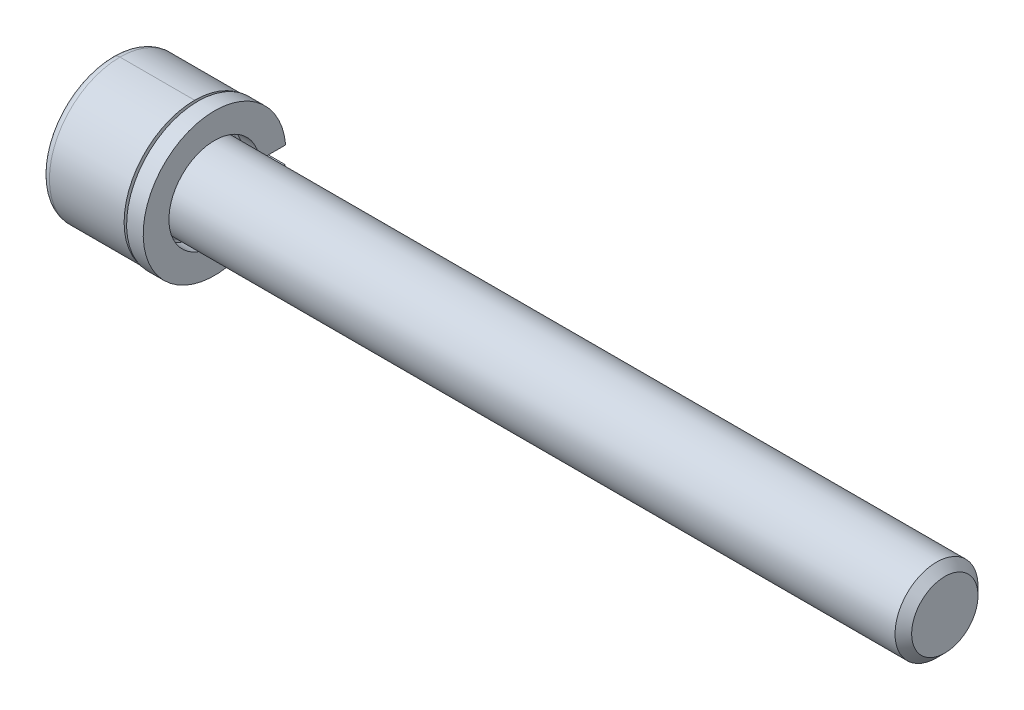
ISO-10303-21;
HEADER;
FILE_DESCRIPTION(('STEP AP214'),'2;1');
FILE_NAME('part.step','',(''),(''),'','','');
FILE_SCHEMA(('AUTOMOTIVE_DESIGN { 1 0 10303 214 1 1 1 1 }'));
ENDSEC;
DATA;
#1=APPLICATION_CONTEXT('core data for automotive mechanical design processes');
#2=APPLICATION_PROTOCOL_DEFINITION('international standard','automotive_design',2000,#1);
#3=PRODUCT_CONTEXT('',#1,'mechanical');
#4=PRODUCT('Part','Part','',(#3));
#5=PRODUCT_RELATED_PRODUCT_CATEGORY('part','',(#4));
#6=PRODUCT_DEFINITION_FORMATION('','',#4);
#7=PRODUCT_DEFINITION_CONTEXT('part definition',#1,'design');
#8=PRODUCT_DEFINITION('design','',#6,#7);
#9=PRODUCT_DEFINITION_SHAPE('','',#8);
#10=(LENGTH_UNIT() NAMED_UNIT(*) SI_UNIT(.MILLI.,.METRE.));
#11=(NAMED_UNIT(*) PLANE_ANGLE_UNIT() SI_UNIT($,.RADIAN.));
#12=(NAMED_UNIT(*) SI_UNIT($,.STERADIAN.) SOLID_ANGLE_UNIT());
#13=UNCERTAINTY_MEASURE_WITH_UNIT(LENGTH_MEASURE(1.E-05),#10,'distance_accuracy_value','');
#14=(GEOMETRIC_REPRESENTATION_CONTEXT(3) GLOBAL_UNCERTAINTY_ASSIGNED_CONTEXT((#13)) GLOBAL_UNIT_ASSIGNED_CONTEXT((#10,
#11,#12)) REPRESENTATION_CONTEXT('',''));
#15=CARTESIAN_POINT('',(0.,0.,0.));
#16=DIRECTION('',(0.,0.,1.));
#17=DIRECTION('',(1.,0.,0.));
#18=AXIS2_PLACEMENT_3D('',#15,#16,#17);
#19=CARTESIAN_POINT('',(1.2,0.,0.));
#20=DIRECTION('',(-1.,0.,0.));
#21=DIRECTION('',(0.,-1.,0.));
#22=AXIS2_PLACEMENT_3D('',#19,#20,#21);
#23=CYLINDRICAL_SURFACE('',#22,4.3);
#24=CARTESIAN_POINT('',(0.2,0.,0.));
#25=DIRECTION('',(1.,0.,0.));
#26=DIRECTION('',(0.,1.,0.));
#27=AXIS2_PLACEMENT_3D('',#24,#25,#26);
#28=CIRCLE('',#27,4.3);
#29=CARTESIAN_POINT('',(0.2,0.374431043820241,-4.28366681634131));
#30=VERTEX_POINT('',#29);
#31=CARTESIAN_POINT('',(0.2,-0.63593269228035,-4.25271555725152));
#32=VERTEX_POINT('',#31);
#33=EDGE_CURVE('P0_E79',#30,#32,#28,.T.);
#34=ORIENTED_EDGE('',*,*,#33,.T.);
#35=DIRECTION('',(-1.,0.,0.));
#36=VECTOR('',#35,1.);
#37=CARTESIAN_POINT('',(1.2,-0.63593269228035,-4.25271555725152));
#38=LINE('',#37,#36);
#39=CARTESIAN_POINT('',(1.2,-0.63593269228035,-4.25271555725152));
#40=VERTEX_POINT('',#39);
#41=EDGE_CURVE('P0_E11',#40,#32,#38,.T.);
#42=ORIENTED_EDGE('',*,*,#41,.F.);
#43=CARTESIAN_POINT('',(1.2,0.,0.));
#44=DIRECTION('',(1.,0.,0.));
#45=DIRECTION('',(0.,1.,0.));
#46=AXIS2_PLACEMENT_3D('',#43,#44,#45);
#47=CIRCLE('',#46,4.3);
#48=CARTESIAN_POINT('',(1.2,0.374431043820241,-4.28366681634131));
#49=VERTEX_POINT('',#48);
#50=EDGE_CURVE('P0_E69',#49,#40,#47,.T.);
#51=ORIENTED_EDGE('',*,*,#50,.F.);
#52=DIRECTION('',(-1.,0.,0.));
#53=VECTOR('',#52,1.);
#54=CARTESIAN_POINT('',(1.2,0.374431043820241,-4.28366681634131));
#55=LINE('',#54,#53);
#56=EDGE_CURVE('P0_E76',#49,#30,#55,.T.);
#57=ORIENTED_EDGE('',*,*,#56,.T.);
#58=EDGE_LOOP('',(#34,#42,#51,#57));
#59=FACE_BOUND('',#58,.T.);
#60=ADVANCED_FACE('P0_F17',(#59),#23,.T.);
#61=CARTESIAN_POINT('',(1.2,-0.63593269228035,-2.67546063527181));
#62=DIRECTION('',(0.,-1.,0.));
#63=DIRECTION('',(1.,0.,0.));
#64=AXIS2_PLACEMENT_3D('',#61,#62,#63);
#65=PLANE('',#64);
#66=DIRECTION('',(0.,0.,1.));
#67=VECTOR('',#66,1.);
#68=CARTESIAN_POINT('',(0.2,-0.63593269228035,-2.67546063527181));
#69=LINE('',#68,#67);
#70=CARTESIAN_POINT('',(0.2,-0.63593269228035,-2.67546063527181));
#71=VERTEX_POINT('',#70);
#72=EDGE_CURVE('P0_E71',#32,#71,#69,.T.);
#73=ORIENTED_EDGE('',*,*,#72,.T.);
#74=DIRECTION('',(-1.,0.,0.));
#75=VECTOR('',#74,1.);
#76=CARTESIAN_POINT('',(1.2,-0.63593269228035,-2.67546063527181));
#77=LINE('',#76,#75);
#78=CARTESIAN_POINT('',(1.2,-0.63593269228035,-2.67546063527181));
#79=VERTEX_POINT('',#78);
#80=EDGE_CURVE('P0_E25',#79,#71,#77,.T.);
#81=ORIENTED_EDGE('',*,*,#80,.F.);
#82=DIRECTION('',(0.,0.,1.));
#83=VECTOR('',#82,1.);
#84=CARTESIAN_POINT('',(1.2,-0.63593269228035,-2.67546063527181));
#85=LINE('',#84,#83);
#86=EDGE_CURVE('P0_E64',#40,#79,#85,.T.);
#87=ORIENTED_EDGE('',*,*,#86,.F.);
#88=ORIENTED_EDGE('',*,*,#41,.T.);
#89=EDGE_LOOP('',(#73,#81,#87,#88));
#90=FACE_BOUND('',#89,.T.);
#91=ADVANCED_FACE('P0_F75',(#90),#65,.F.);
#92=CARTESIAN_POINT('',(1.2,0.,0.));
#93=DIRECTION('',(-1.,0.,0.));
#94=DIRECTION('',(0.,-1.,0.));
#95=AXIS2_PLACEMENT_3D('',#92,#93,#94);
#96=CYLINDRICAL_SURFACE('',#95,2.75);
#97=CARTESIAN_POINT('',(0.2,0.,0.));
#98=DIRECTION('',(-1.,0.,0.));
#99=DIRECTION('',(0.,1.,0.));
#100=AXIS2_PLACEMENT_3D('',#97,#98,#99);
#101=CIRCLE('',#100,2.75);
#102=CARTESIAN_POINT('',(0.2,0.37443104382024,-2.72439009567714));
#103=VERTEX_POINT('',#102);
#104=EDGE_CURVE('P0_E49',#71,#103,#101,.T.);
#105=ORIENTED_EDGE('',*,*,#104,.T.);
#106=DIRECTION('',(-1.,0.,0.));
#107=VECTOR('',#106,1.);
#108=CARTESIAN_POINT('',(1.2,0.374431043820241,-2.72439009567714));
#109=LINE('',#108,#107);
#110=CARTESIAN_POINT('',(1.2,0.374431043820241,-2.72439009567714));
#111=VERTEX_POINT('',#110);
#112=EDGE_CURVE('P0_E73',#111,#103,#109,.T.);
#113=ORIENTED_EDGE('',*,*,#112,.F.);
#114=CARTESIAN_POINT('',(1.2,0.,0.));
#115=DIRECTION('',(-1.,0.,0.));
#116=DIRECTION('',(0.,1.,0.));
#117=AXIS2_PLACEMENT_3D('',#114,#115,#116);
#118=CIRCLE('',#117,2.75);
#119=EDGE_CURVE('P0_E67',#79,#111,#118,.T.);
#120=ORIENTED_EDGE('',*,*,#119,.F.);
#121=ORIENTED_EDGE('',*,*,#80,.T.);
#122=EDGE_LOOP('',(#105,#113,#120,#121));
#123=FACE_BOUND('',#122,.T.);
#124=ADVANCED_FACE('P0_F72',(#123),#96,.F.);
#125=CARTESIAN_POINT('',(1.2,0.374431043820241,-2.72439009567714));
#126=DIRECTION('',(0.,1.,0.));
#127=DIRECTION('',(-1.,0.,0.));
#128=AXIS2_PLACEMENT_3D('',#125,#126,#127);
#129=PLANE('',#128);
#130=DIRECTION('',(0.,0.,-1.));
#131=VECTOR('',#130,1.);
#132=CARTESIAN_POINT('',(0.2,0.374431043820241,-2.72439009567714));
#133=LINE('',#132,#131);
#134=EDGE_CURVE('P0_E57',#103,#30,#133,.T.);
#135=ORIENTED_EDGE('',*,*,#134,.T.);
#136=ORIENTED_EDGE('',*,*,#56,.F.);
#137=DIRECTION('',(0.,0.,-1.));
#138=VECTOR('',#137,1.);
#139=CARTESIAN_POINT('',(1.2,0.374431043820241,-2.72439009567714));
#140=LINE('',#139,#138);
#141=EDGE_CURVE('P0_E31',#111,#49,#140,.T.);
#142=ORIENTED_EDGE('',*,*,#141,.F.);
#143=ORIENTED_EDGE('',*,*,#112,.T.);
#144=EDGE_LOOP('',(#135,#136,#142,#143));
#145=FACE_BOUND('',#144,.T.);
#146=ADVANCED_FACE('P0_F87',(#145),#129,.F.);
#147=CARTESIAN_POINT('',(1.2,0.,0.));
#148=DIRECTION('',(1.,0.,0.));
#149=DIRECTION('',(0.,1.,0.));
#150=AXIS2_PLACEMENT_3D('',#147,#148,#149);
#151=PLANE('',#150);
#152=ORIENTED_EDGE('',*,*,#50,.T.);
#153=ORIENTED_EDGE('',*,*,#86,.T.);
#154=ORIENTED_EDGE('',*,*,#119,.T.);
#155=ORIENTED_EDGE('',*,*,#141,.T.);
#156=EDGE_LOOP('',(#152,#153,#154,#155));
#157=FACE_BOUND('',#156,.T.);
#158=ADVANCED_FACE('P0_F63',(#157),#151,.T.);
#159=CARTESIAN_POINT('',(0.2,0.,0.));
#160=DIRECTION('',(1.,0.,0.));
#161=DIRECTION('',(0.,1.,0.));
#162=AXIS2_PLACEMENT_3D('',#159,#160,#161);
#163=PLANE('',#162);
#164=ORIENTED_EDGE('',*,*,#33,.F.);
#165=ORIENTED_EDGE('',*,*,#134,.F.);
#166=ORIENTED_EDGE('',*,*,#104,.F.);
#167=ORIENTED_EDGE('',*,*,#72,.F.);
#168=EDGE_LOOP('',(#164,#165,#166,#167));
#169=FACE_BOUND('',#168,.T.);
#170=ADVANCED_FACE('P0_F89',(#169),#163,.F.);
#171=CLOSED_SHELL('',(#60,#91,#124,#146,#158,#170));
#172=MANIFOLD_SOLID_BREP('P0_B1',#171);
#173=CARTESIAN_POINT('',(-1.17700185815197,0.,0.));
#174=DIRECTION('',(-1.,0.,0.));
#175=DIRECTION('',(0.,1.,0.));
#176=AXIS2_PLACEMENT_3D('',#173,#174,#175);
#177=CYLINDRICAL_SURFACE('',#176,2.5);
#178=CARTESIAN_POINT('',(44.7,0.,0.));
#179=DIRECTION('',(-1.,0.,0.));
#180=DIRECTION('',(0.,-1.,0.));
#181=AXIS2_PLACEMENT_3D('',#178,#179,#180);
#182=CIRCLE('',#181,2.5);
#183=CARTESIAN_POINT('',(44.7,-2.5,0.));
#184=VERTEX_POINT('',#183);
#185=EDGE_CURVE('P1_E21',#184,#184,#182,.T.);
#186=ORIENTED_EDGE('',*,*,#185,.T.);
#187=EDGE_LOOP('',(#186));
#188=FACE_BOUND('',#187,.T.);
#189=CARTESIAN_POINT('',(0.200000000000003,0.,0.));
#190=DIRECTION('',(-1.,0.,0.));
#191=DIRECTION('',(0.,-1.,0.));
#192=AXIS2_PLACEMENT_3D('',#189,#190,#191);
#193=CIRCLE('',#192,2.5);
#194=CARTESIAN_POINT('',(0.200000000000003,2.5,0.));
#195=VERTEX_POINT('',#194);
#196=CARTESIAN_POINT('',(0.200000000000003,-2.5,0.));
#197=VERTEX_POINT('',#196);
#198=EDGE_CURVE('P1_E31',#195,#197,#193,.T.);
#199=ORIENTED_EDGE('',*,*,#198,.F.);
#200=CARTESIAN_POINT('',(0.200000000000003,0.,0.));
#201=DIRECTION('',(-1.,0.,0.));
#202=DIRECTION('',(0.,-1.,0.));
#203=AXIS2_PLACEMENT_3D('',#200,#201,#202);
#204=CIRCLE('',#203,2.5);
#205=EDGE_CURVE('P1_E252',#197,#195,#204,.T.);
#206=ORIENTED_EDGE('',*,*,#205,.F.);
#207=EDGE_LOOP('',(#199,#206));
#208=FACE_BOUND('',#207,.T.);
#209=ADVANCED_FACE('P1_F17',(#188,#208),#177,.T.);
#210=CARTESIAN_POINT('',(0.200000000000003,0.,0.));
#211=DIRECTION('',(-1.,0.,0.));
#212=DIRECTION('',(0.,1.,0.));
#213=AXIS2_PLACEMENT_3D('',#210,#211,#212);
#214=TOROIDAL_SURFACE('',#213,2.7,0.2);
#215=CARTESIAN_POINT('',(0.2,2.7,0.));
#216=DIRECTION('',(0.,0.,1.));
#217=DIRECTION('',(0.,-1.,0.));
#218=AXIS2_PLACEMENT_3D('',#215,#216,#217);
#219=CIRCLE('',#218,0.2);
#220=CARTESIAN_POINT('',(0.,2.7,0.));
#221=VERTEX_POINT('',#220);
#222=EDGE_CURVE('P1_E254',#221,#195,#219,.T.);
#223=ORIENTED_EDGE('',*,*,#222,.F.);
#224=CARTESIAN_POINT('',(0.,0.,0.));
#225=DIRECTION('',(-1.,0.,0.));
#226=DIRECTION('',(0.,-1.,0.));
#227=AXIS2_PLACEMENT_3D('',#224,#225,#226);
#228=CIRCLE('',#227,2.7);
#229=CARTESIAN_POINT('',(0.,-2.7,0.));
#230=VERTEX_POINT('',#229);
#231=EDGE_CURVE('P1_E250',#230,#221,#228,.T.);
#232=ORIENTED_EDGE('',*,*,#231,.F.);
#233=CARTESIAN_POINT('',(0.200000000000003,-2.7,0.));
#234=DIRECTION('',(0.,0.,-1.));
#235=DIRECTION('',(-1.,0.,0.));
#236=AXIS2_PLACEMENT_3D('',#233,#234,#235);
#237=CIRCLE('',#236,0.2);
#238=EDGE_CURVE('P1_E249',#230,#197,#237,.T.);
#239=ORIENTED_EDGE('',*,*,#238,.T.);
#240=ORIENTED_EDGE('',*,*,#205,.T.);
#241=EDGE_LOOP('',(#223,#232,#239,#240));
#242=FACE_BOUND('',#241,.T.);
#243=ADVANCED_FACE('P1_F264',(#242),#214,.F.);
#244=CARTESIAN_POINT('',(0.200000000000003,0.,0.));
#245=DIRECTION('',(-1.,0.,0.));
#246=DIRECTION('',(0.,1.,0.));
#247=AXIS2_PLACEMENT_3D('',#244,#245,#246);
#248=TOROIDAL_SURFACE('',#247,2.7,0.2);
#249=CARTESIAN_POINT('',(0.,0.,0.));
#250=DIRECTION('',(-1.,0.,0.));
#251=DIRECTION('',(0.,-1.,0.));
#252=AXIS2_PLACEMENT_3D('',#249,#250,#251);
#253=CIRCLE('',#252,2.7);
#254=EDGE_CURVE('P1_E242',#221,#230,#253,.T.);
#255=ORIENTED_EDGE('',*,*,#254,.F.);
#256=ORIENTED_EDGE('',*,*,#222,.T.);
#257=ORIENTED_EDGE('',*,*,#198,.T.);
#258=ORIENTED_EDGE('',*,*,#238,.F.);
#259=EDGE_LOOP('',(#255,#256,#257,#258));
#260=FACE_BOUND('',#259,.T.);
#261=ADVANCED_FACE('P1_F267',(#260),#248,.F.);
#262=CARTESIAN_POINT('',(0.,4.25,0.));
#263=DIRECTION('',(-1.,0.,0.));
#264=DIRECTION('',(0.,1.,0.));
#265=AXIS2_PLACEMENT_3D('',#262,#263,#264);
#266=PLANE('',#265);
#267=CARTESIAN_POINT('',(0.,0.,0.));
#268=DIRECTION('',(-1.,0.,0.));
#269=DIRECTION('',(0.,-1.,0.));
#270=AXIS2_PLACEMENT_3D('',#267,#268,#269);
#271=CIRCLE('',#270,4.25);
#272=CARTESIAN_POINT('',(0.,-4.25,0.));
#273=VERTEX_POINT('',#272);
#274=CARTESIAN_POINT('',(0.,4.25,0.));
#275=VERTEX_POINT('',#274);
#276=EDGE_CURVE('P1_E236',#273,#275,#271,.T.);
#277=ORIENTED_EDGE('',*,*,#276,.F.);
#278=CARTESIAN_POINT('',(0.,0.,0.));
#279=DIRECTION('',(-1.,0.,0.));
#280=DIRECTION('',(0.,-1.,0.));
#281=AXIS2_PLACEMENT_3D('',#278,#279,#280);
#282=CIRCLE('',#281,4.25);
#283=EDGE_CURVE('P1_E228',#275,#273,#282,.T.);
#284=ORIENTED_EDGE('',*,*,#283,.F.);
#285=EDGE_LOOP('',(#277,#284));
#286=FACE_BOUND('',#285,.T.);
#287=ORIENTED_EDGE('',*,*,#231,.T.);
#288=ORIENTED_EDGE('',*,*,#254,.T.);
#289=EDGE_LOOP('',(#287,#288));
#290=FACE_BOUND('',#289,.T.);
#291=ADVANCED_FACE('P1_F271',(#286,#290),#266,.F.);
#292=CARTESIAN_POINT('',(-1.17700185815197,0.,0.));
#293=DIRECTION('',(-1.,0.,0.));
#294=DIRECTION('',(0.,1.,0.));
#295=AXIS2_PLACEMENT_3D('',#292,#293,#294);
#296=CYLINDRICAL_SURFACE('',#295,4.25);
#297=ORIENTED_EDGE('',*,*,#276,.T.);
#298=DIRECTION('',(-1.,0.,0.));
#299=VECTOR('',#298,1.);
#300=CARTESIAN_POINT('',(-1.17700185815198,4.25,0.));
#301=LINE('',#300,#299);
#302=CARTESIAN_POINT('',(-4.5,4.25,0.));
#303=VERTEX_POINT('',#302);
#304=EDGE_CURVE('P1_E233',#303,#275,#301,.F.);
#305=ORIENTED_EDGE('',*,*,#304,.F.);
#306=CARTESIAN_POINT('',(-4.5,0.,0.));
#307=DIRECTION('',(-1.,0.,0.));
#308=DIRECTION('',(0.,-1.,0.));
#309=AXIS2_PLACEMENT_3D('',#306,#307,#308);
#310=CIRCLE('',#309,4.25);
#311=CARTESIAN_POINT('',(-4.5,-4.25,0.));
#312=VERTEX_POINT('',#311);
#313=EDGE_CURVE('P1_E225',#312,#303,#310,.T.);
#314=ORIENTED_EDGE('',*,*,#313,.F.);
#315=DIRECTION('',(-1.,0.,0.));
#316=VECTOR('',#315,1.);
#317=CARTESIAN_POINT('',(-1.17700185815197,-4.25,0.));
#318=LINE('',#317,#316);
#319=EDGE_CURVE('P1_E223',#312,#273,#318,.F.);
#320=ORIENTED_EDGE('',*,*,#319,.T.);
#321=EDGE_LOOP('',(#297,#305,#314,#320));
#322=FACE_BOUND('',#321,.T.);
#323=ADVANCED_FACE('P1_F272',(#322),#296,.T.);
#324=CARTESIAN_POINT('',(-1.17700185815197,0.,0.));
#325=DIRECTION('',(-1.,0.,0.));
#326=DIRECTION('',(0.,1.,0.));
#327=AXIS2_PLACEMENT_3D('',#324,#325,#326);
#328=CYLINDRICAL_SURFACE('',#327,4.25);
#329=ORIENTED_EDGE('',*,*,#304,.T.);
#330=ORIENTED_EDGE('',*,*,#283,.T.);
#331=ORIENTED_EDGE('',*,*,#319,.F.);
#332=CARTESIAN_POINT('',(-4.5,0.,0.));
#333=DIRECTION('',(-1.,0.,0.));
#334=DIRECTION('',(0.,-1.,0.));
#335=AXIS2_PLACEMENT_3D('',#332,#333,#334);
#336=CIRCLE('',#335,4.25);
#337=EDGE_CURVE('P1_E214',#303,#312,#336,.T.);
#338=ORIENTED_EDGE('',*,*,#337,.F.);
#339=EDGE_LOOP('',(#329,#330,#331,#338));
#340=FACE_BOUND('',#339,.T.);
#341=ADVANCED_FACE('P1_F282',(#340),#328,.T.);
#342=CARTESIAN_POINT('',(-4.5,0.,0.));
#343=DIRECTION('',(-1.,0.,0.));
#344=DIRECTION('',(0.,1.,0.));
#345=AXIS2_PLACEMENT_3D('',#342,#343,#344);
#346=TOROIDAL_SURFACE('',#345,3.75,0.5);
#347=ORIENTED_EDGE('',*,*,#313,.T.);
#348=CARTESIAN_POINT('',(-4.5,3.75,0.));
#349=DIRECTION('',(0.,0.,1.));
#350=DIRECTION('',(0.,-1.,0.));
#351=AXIS2_PLACEMENT_3D('',#348,#349,#350);
#352=CIRCLE('',#351,0.5);
#353=CARTESIAN_POINT('',(-5.,3.75,0.));
#354=VERTEX_POINT('',#353);
#355=EDGE_CURVE('P1_E217',#354,#303,#352,.F.);
#356=ORIENTED_EDGE('',*,*,#355,.F.);
#357=CARTESIAN_POINT('',(-5.,0.,0.));
#358=DIRECTION('',(-1.,0.,0.));
#359=DIRECTION('',(0.,-1.,0.));
#360=AXIS2_PLACEMENT_3D('',#357,#358,#359);
#361=CIRCLE('',#360,3.75);
#362=CARTESIAN_POINT('',(-5.,-3.75,0.));
#363=VERTEX_POINT('',#362);
#364=EDGE_CURVE('P1_E209',#363,#354,#361,.T.);
#365=ORIENTED_EDGE('',*,*,#364,.F.);
#366=CARTESIAN_POINT('',(-4.5,-3.75,0.));
#367=DIRECTION('',(0.,0.,-1.));
#368=DIRECTION('',(-1.,0.,0.));
#369=AXIS2_PLACEMENT_3D('',#366,#367,#368);
#370=CIRCLE('',#369,0.5);
#371=EDGE_CURVE('P1_E211',#363,#312,#370,.F.);
#372=ORIENTED_EDGE('',*,*,#371,.T.);
#373=EDGE_LOOP('',(#347,#356,#365,#372));
#374=FACE_BOUND('',#373,.T.);
#375=ADVANCED_FACE('P1_F368',(#374),#346,.T.);
#376=CARTESIAN_POINT('',(-4.5,0.,0.));
#377=DIRECTION('',(-1.,0.,0.));
#378=DIRECTION('',(0.,1.,0.));
#379=AXIS2_PLACEMENT_3D('',#376,#377,#378);
#380=TOROIDAL_SURFACE('',#379,3.75,0.5);
#381=ORIENTED_EDGE('',*,*,#355,.T.);
#382=ORIENTED_EDGE('',*,*,#337,.T.);
#383=ORIENTED_EDGE('',*,*,#371,.F.);
#384=CARTESIAN_POINT('',(-5.,0.,0.));
#385=DIRECTION('',(-1.,0.,0.));
#386=DIRECTION('',(0.,-1.,0.));
#387=AXIS2_PLACEMENT_3D('',#384,#385,#386);
#388=CIRCLE('',#387,3.75);
#389=EDGE_CURVE('P1_E200',#354,#363,#388,.T.);
#390=ORIENTED_EDGE('',*,*,#389,.F.);
#391=EDGE_LOOP('',(#381,#382,#383,#390));
#392=FACE_BOUND('',#391,.T.);
#393=ADVANCED_FACE('P1_F362',(#392),#380,.T.);
#394=CARTESIAN_POINT('',(-5.,2.2915,0.));
#395=DIRECTION('',(1.,0.,0.));
#396=DIRECTION('',(0.,-1.,0.));
#397=AXIS2_PLACEMENT_3D('',#394,#395,#396);
#398=PLANE('',#397);
#399=DIRECTION('',(0.,0.5,0.866025403784438));
#400=VECTOR('',#399,1.);
#401=CARTESIAN_POINT('',(-5.,-2.2915,0.));
#402=LINE('',#401,#400);
#403=CARTESIAN_POINT('',(-5.,-2.2915,0.));
#404=VERTEX_POINT('',#403);
#405=CARTESIAN_POINT('',(-5.,-1.14575,1.98449721277204));
#406=VERTEX_POINT('',#405);
#407=EDGE_CURVE('P1_E163',#404,#406,#402,.T.);
#408=ORIENTED_EDGE('',*,*,#407,.F.);
#409=DIRECTION('',(0.,-0.5,0.866025403784438));
#410=VECTOR('',#409,1.);
#411=CARTESIAN_POINT('',(-5.,-1.14575,-1.98449721277204));
#412=LINE('',#411,#410);
#413=CARTESIAN_POINT('',(-5.,-1.14575,-1.98449721277204));
#414=VERTEX_POINT('',#413);
#415=EDGE_CURVE('P1_E154',#414,#404,#412,.T.);
#416=ORIENTED_EDGE('',*,*,#415,.F.);
#417=DIRECTION('',(0.,-1.,0.));
#418=VECTOR('',#417,1.);
#419=CARTESIAN_POINT('',(-5.,1.14575,-1.98449721277205));
#420=LINE('',#419,#418);
#421=CARTESIAN_POINT('',(-5.,1.14575,-1.98449721277204));
#422=VERTEX_POINT('',#421);
#423=EDGE_CURVE('P1_E178',#422,#414,#420,.T.);
#424=ORIENTED_EDGE('',*,*,#423,.F.);
#425=DIRECTION('',(0.,-0.5,-0.866025403784439));
#426=VECTOR('',#425,1.);
#427=CARTESIAN_POINT('',(-5.,2.2915,0.));
#428=LINE('',#427,#426);
#429=CARTESIAN_POINT('',(-5.,2.2915,0.));
#430=VERTEX_POINT('',#429);
#431=EDGE_CURVE('P1_E183',#430,#422,#428,.T.);
#432=ORIENTED_EDGE('',*,*,#431,.F.);
#433=DIRECTION('',(0.,0.5,-0.866025403784439));
#434=VECTOR('',#433,1.);
#435=CARTESIAN_POINT('',(-5.,1.14575,1.98449721277204));
#436=LINE('',#435,#434);
#437=CARTESIAN_POINT('',(-5.,1.14575,1.98449721277204));
#438=VERTEX_POINT('',#437);
#439=EDGE_CURVE('P1_E156',#438,#430,#436,.T.);
#440=ORIENTED_EDGE('',*,*,#439,.F.);
#441=DIRECTION('',(0.,1.,0.));
#442=VECTOR('',#441,1.);
#443=CARTESIAN_POINT('',(-5.,-1.14575,1.98449721277204));
#444=LINE('',#443,#442);
#445=EDGE_CURVE('P1_E168',#406,#438,#444,.T.);
#446=ORIENTED_EDGE('',*,*,#445,.F.);
#447=EDGE_LOOP('',(#408,#416,#424,#432,#440,#446));
#448=FACE_BOUND('',#447,.T.);
#449=ORIENTED_EDGE('',*,*,#364,.T.);
#450=ORIENTED_EDGE('',*,*,#389,.T.);
#451=EDGE_LOOP('',(#449,#450));
#452=FACE_BOUND('',#451,.T.);
#453=ADVANCED_FACE('P1_F359',(#448,#452),#398,.F.);
#454=CARTESIAN_POINT('',(-2.5,2.2915,0.));
#455=DIRECTION('',(0.,0.866025403784439,-0.5));
#456=DIRECTION('',(0.,-0.5,-0.866025403784439));
#457=AXIS2_PLACEMENT_3D('',#454,#455,#456);
#458=PLANE('',#457);
#459=ORIENTED_EDGE('',*,*,#431,.T.);
#460=DIRECTION('',(-1.,0.,0.));
#461=VECTOR('',#460,1.);
#462=CARTESIAN_POINT('',(-2.5,1.14575,-1.98449721277205));
#463=LINE('',#462,#461);
#464=CARTESIAN_POINT('',(-2.5,1.14575,-1.98449721277205));
#465=VERTEX_POINT('',#464);
#466=EDGE_CURVE('P1_E190',#465,#422,#463,.T.);
#467=ORIENTED_EDGE('',*,*,#466,.F.);
#468=DIRECTION('',(0.,-0.5,-0.866025403784439));
#469=VECTOR('',#468,1.);
#470=CARTESIAN_POINT('',(-2.5,2.2915,0.));
#471=LINE('',#470,#469);
#472=CARTESIAN_POINT('',(-2.5,2.2915,0.));
#473=VERTEX_POINT('',#472);
#474=EDGE_CURVE('P1_E164',#473,#465,#471,.T.);
#475=ORIENTED_EDGE('',*,*,#474,.F.);
#476=DIRECTION('',(-1.,0.,0.));
#477=VECTOR('',#476,1.);
#478=CARTESIAN_POINT('',(-2.5,2.2915,0.));
#479=LINE('',#478,#477);
#480=EDGE_CURVE('P1_E177',#473,#430,#479,.T.);
#481=ORIENTED_EDGE('',*,*,#480,.T.);
#482=EDGE_LOOP('',(#459,#467,#475,#481));
#483=FACE_BOUND('',#482,.T.);
#484=ADVANCED_FACE('P1_F353',(#483),#458,.F.);
#485=CARTESIAN_POINT('',(-2.5,-1.14575,1.98449721277204));
#486=DIRECTION('',(0.,0.,1.));
#487=DIRECTION('',(0.,1.,0.));
#488=AXIS2_PLACEMENT_3D('',#485,#486,#487);
#489=PLANE('',#488);
#490=ORIENTED_EDGE('',*,*,#445,.T.);
#491=DIRECTION('',(-1.,0.,0.));
#492=VECTOR('',#491,1.);
#493=CARTESIAN_POINT('',(-2.5,1.14575,1.98449721277204));
#494=LINE('',#493,#492);
#495=CARTESIAN_POINT('',(-2.5,1.14575,1.98449721277204));
#496=VERTEX_POINT('',#495);
#497=EDGE_CURVE('P1_E173',#496,#438,#494,.T.);
#498=ORIENTED_EDGE('',*,*,#497,.F.);
#499=DIRECTION('',(0.,1.,0.));
#500=VECTOR('',#499,1.);
#501=CARTESIAN_POINT('',(-2.5,-1.14575,1.98449721277204));
#502=LINE('',#501,#500);
#503=CARTESIAN_POINT('',(-2.5,-1.14575,1.98449721277204));
#504=VERTEX_POINT('',#503);
#505=EDGE_CURVE('P1_E157',#504,#496,#502,.T.);
#506=ORIENTED_EDGE('',*,*,#505,.F.);
#507=DIRECTION('',(-1.,0.,0.));
#508=VECTOR('',#507,1.);
#509=CARTESIAN_POINT('',(-2.5,-1.14575,1.98449721277204));
#510=LINE('',#509,#508);
#511=EDGE_CURVE('P1_E167',#504,#406,#510,.T.);
#512=ORIENTED_EDGE('',*,*,#511,.T.);
#513=EDGE_LOOP('',(#490,#498,#506,#512));
#514=FACE_BOUND('',#513,.T.);
#515=ADVANCED_FACE('P1_F349',(#514),#489,.F.);
#516=CARTESIAN_POINT('',(-2.5,-1.14575,-1.98449721277204));
#517=DIRECTION('',(0.,-0.866025403784438,-0.5));
#518=DIRECTION('',(0.,-0.5,0.866025403784438));
#519=AXIS2_PLACEMENT_3D('',#516,#517,#518);
#520=PLANE('',#519);
#521=ORIENTED_EDGE('',*,*,#415,.T.);
#522=DIRECTION('',(-1.,0.,0.));
#523=VECTOR('',#522,1.);
#524=CARTESIAN_POINT('',(-2.5,-2.2915,0.));
#525=LINE('',#524,#523);
#526=CARTESIAN_POINT('',(-2.5,-2.2915,0.));
#527=VERTEX_POINT('',#526);
#528=EDGE_CURVE('P1_E159',#527,#404,#525,.T.);
#529=ORIENTED_EDGE('',*,*,#528,.F.);
#530=DIRECTION('',(0.,-0.5,0.866025403784438));
#531=VECTOR('',#530,1.);
#532=CARTESIAN_POINT('',(-2.5,-1.14575,-1.98449721277204));
#533=LINE('',#532,#531);
#534=CARTESIAN_POINT('',(-2.5,-1.14575,-1.98449721277204));
#535=VERTEX_POINT('',#534);
#536=EDGE_CURVE('P1_E147',#535,#527,#533,.T.);
#537=ORIENTED_EDGE('',*,*,#536,.F.);
#538=DIRECTION('',(-1.,0.,0.));
#539=VECTOR('',#538,1.);
#540=CARTESIAN_POINT('',(-2.5,-1.14575,-1.98449721277204));
#541=LINE('',#540,#539);
#542=EDGE_CURVE('P1_E151',#535,#414,#541,.T.);
#543=ORIENTED_EDGE('',*,*,#542,.T.);
#544=EDGE_LOOP('',(#521,#529,#537,#543));
#545=FACE_BOUND('',#544,.T.);
#546=ADVANCED_FACE('P1_F350',(#545),#520,.F.);
#547=CARTESIAN_POINT('',(-2.5,1.14575,1.98449721277204));
#548=DIRECTION('',(0.,0.866025403784439,0.5));
#549=DIRECTION('',(0.,0.5,-0.866025403784439));
#550=AXIS2_PLACEMENT_3D('',#547,#548,#549);
#551=PLANE('',#550);
#552=ORIENTED_EDGE('',*,*,#439,.T.);
#553=ORIENTED_EDGE('',*,*,#480,.F.);
#554=DIRECTION('',(0.,0.5,-0.866025403784439));
#555=VECTOR('',#554,1.);
#556=CARTESIAN_POINT('',(-2.5,1.14575,1.98449721277204));
#557=LINE('',#556,#555);
#558=EDGE_CURVE('P1_E148',#496,#473,#557,.T.);
#559=ORIENTED_EDGE('',*,*,#558,.F.);
#560=ORIENTED_EDGE('',*,*,#497,.T.);
#561=EDGE_LOOP('',(#552,#553,#559,#560));
#562=FACE_BOUND('',#561,.T.);
#563=ADVANCED_FACE('P1_F345',(#562),#551,.F.);
#564=CARTESIAN_POINT('',(-2.5,1.14575,-1.98449721277205));
#565=DIRECTION('',(0.,0.,-1.));
#566=DIRECTION('',(0.,-1.,0.));
#567=AXIS2_PLACEMENT_3D('',#564,#565,#566);
#568=PLANE('',#567);
#569=ORIENTED_EDGE('',*,*,#423,.T.);
#570=ORIENTED_EDGE('',*,*,#542,.F.);
#571=DIRECTION('',(0.,-1.,0.));
#572=VECTOR('',#571,1.);
#573=CARTESIAN_POINT('',(-2.5,1.14575,-1.98449721277205));
#574=LINE('',#573,#572);
#575=EDGE_CURVE('P1_E128',#465,#535,#574,.T.);
#576=ORIENTED_EDGE('',*,*,#575,.F.);
#577=ORIENTED_EDGE('',*,*,#466,.T.);
#578=EDGE_LOOP('',(#569,#570,#576,#577));
#579=FACE_BOUND('',#578,.T.);
#580=ADVANCED_FACE('P1_F339',(#579),#568,.F.);
#581=CARTESIAN_POINT('',(-2.5,-2.2915,0.));
#582=DIRECTION('',(0.,-0.866025403784438,0.5));
#583=DIRECTION('',(0.,0.5,0.866025403784438));
#584=AXIS2_PLACEMENT_3D('',#581,#582,#583);
#585=PLANE('',#584);
#586=ORIENTED_EDGE('',*,*,#407,.T.);
#587=ORIENTED_EDGE('',*,*,#511,.F.);
#588=DIRECTION('',(0.,0.5,0.866025403784438));
#589=VECTOR('',#588,1.);
#590=CARTESIAN_POINT('',(-2.5,-2.2915,0.));
#591=LINE('',#590,#589);
#592=EDGE_CURVE('P1_E120',#527,#504,#591,.T.);
#593=ORIENTED_EDGE('',*,*,#592,.F.);
#594=ORIENTED_EDGE('',*,*,#528,.T.);
#595=EDGE_LOOP('',(#586,#587,#593,#594));
#596=FACE_BOUND('',#595,.T.);
#597=ADVANCED_FACE('P1_F331',(#596),#585,.F.);
#598=CARTESIAN_POINT('',(-2.5,0.,0.));
#599=DIRECTION('',(-1.,0.,0.));
#600=DIRECTION('',(0.,1.,0.));
#601=AXIS2_PLACEMENT_3D('',#598,#599,#600);
#602=PLANE('',#601);
#603=ORIENTED_EDGE('',*,*,#474,.T.);
#604=CARTESIAN_POINT('',(-2.5,0.,0.));
#605=DIRECTION('',(-1.,0.,0.));
#606=DIRECTION('',(0.,-1.,0.));
#607=AXIS2_PLACEMENT_3D('',#604,#605,#606);
#608=CIRCLE('',#607,2.2915);
#609=EDGE_CURVE('P1_E121',#473,#465,#608,.T.);
#610=ORIENTED_EDGE('',*,*,#609,.F.);
#611=EDGE_LOOP('',(#603,#610));
#612=FACE_BOUND('',#611,.T.);
#613=ADVANCED_FACE('P1_F329',(#612),#602,.F.);
#614=CARTESIAN_POINT('',(-2.5,0.,0.));
#615=DIRECTION('',(-1.,0.,0.));
#616=DIRECTION('',(0.,1.,0.));
#617=AXIS2_PLACEMENT_3D('',#614,#615,#616);
#618=PLANE('',#617);
#619=ORIENTED_EDGE('',*,*,#505,.T.);
#620=CARTESIAN_POINT('',(-2.5,0.,0.));
#621=DIRECTION('',(-1.,0.,0.));
#622=DIRECTION('',(0.,-1.,0.));
#623=AXIS2_PLACEMENT_3D('',#620,#621,#622);
#624=CIRCLE('',#623,2.2915);
#625=EDGE_CURVE('P1_E134',#504,#496,#624,.T.);
#626=ORIENTED_EDGE('',*,*,#625,.F.);
#627=EDGE_LOOP('',(#619,#626));
#628=FACE_BOUND('',#627,.T.);
#629=ADVANCED_FACE('P1_F330',(#628),#618,.F.);
#630=CARTESIAN_POINT('',(-2.5,0.,0.));
#631=DIRECTION('',(-1.,0.,0.));
#632=DIRECTION('',(0.,1.,0.));
#633=AXIS2_PLACEMENT_3D('',#630,#631,#632);
#634=PLANE('',#633);
#635=ORIENTED_EDGE('',*,*,#536,.T.);
#636=CARTESIAN_POINT('',(-2.5,0.,0.));
#637=DIRECTION('',(-1.,0.,0.));
#638=DIRECTION('',(0.,-1.,0.));
#639=AXIS2_PLACEMENT_3D('',#636,#637,#638);
#640=CIRCLE('',#639,2.2915);
#641=EDGE_CURVE('P1_E98',#535,#527,#640,.T.);
#642=ORIENTED_EDGE('',*,*,#641,.F.);
#643=EDGE_LOOP('',(#635,#642));
#644=FACE_BOUND('',#643,.T.);
#645=ADVANCED_FACE('P1_F323',(#644),#634,.F.);
#646=CARTESIAN_POINT('',(-2.5,0.,0.));
#647=DIRECTION('',(-1.,0.,0.));
#648=DIRECTION('',(0.,1.,0.));
#649=AXIS2_PLACEMENT_3D('',#646,#647,#648);
#650=PLANE('',#649);
#651=ORIENTED_EDGE('',*,*,#558,.T.);
#652=CARTESIAN_POINT('',(-2.5,0.,0.));
#653=DIRECTION('',(-1.,0.,0.));
#654=DIRECTION('',(0.,-1.,0.));
#655=AXIS2_PLACEMENT_3D('',#652,#653,#654);
#656=CIRCLE('',#655,2.2915);
#657=EDGE_CURVE('P1_E117',#496,#473,#656,.T.);
#658=ORIENTED_EDGE('',*,*,#657,.F.);
#659=EDGE_LOOP('',(#651,#658));
#660=FACE_BOUND('',#659,.T.);
#661=ADVANCED_FACE('P1_F317',(#660),#650,.F.);
#662=CARTESIAN_POINT('',(-2.5,0.,0.));
#663=DIRECTION('',(-1.,0.,0.));
#664=DIRECTION('',(0.,1.,0.));
#665=AXIS2_PLACEMENT_3D('',#662,#663,#664);
#666=PLANE('',#665);
#667=ORIENTED_EDGE('',*,*,#575,.T.);
#668=CARTESIAN_POINT('',(-2.5,0.,0.));
#669=DIRECTION('',(-1.,0.,0.));
#670=DIRECTION('',(0.,-1.,0.));
#671=AXIS2_PLACEMENT_3D('',#668,#669,#670);
#672=CIRCLE('',#671,2.2915);
#673=EDGE_CURVE('P1_E129',#465,#535,#672,.T.);
#674=ORIENTED_EDGE('',*,*,#673,.F.);
#675=EDGE_LOOP('',(#667,#674));
#676=FACE_BOUND('',#675,.T.);
#677=ADVANCED_FACE('P1_F312',(#676),#666,.F.);
#678=CARTESIAN_POINT('',(-2.5,0.,0.));
#679=DIRECTION('',(-1.,0.,0.));
#680=DIRECTION('',(0.,1.,0.));
#681=AXIS2_PLACEMENT_3D('',#678,#679,#680);
#682=PLANE('',#681);
#683=ORIENTED_EDGE('',*,*,#592,.T.);
#684=CARTESIAN_POINT('',(-2.5,0.,0.));
#685=DIRECTION('',(-1.,0.,0.));
#686=DIRECTION('',(0.,-1.,0.));
#687=AXIS2_PLACEMENT_3D('',#684,#685,#686);
#688=CIRCLE('',#687,2.2915);
#689=EDGE_CURVE('P1_E114',#527,#504,#688,.T.);
#690=ORIENTED_EDGE('',*,*,#689,.F.);
#691=EDGE_LOOP('',(#683,#690));
#692=FACE_BOUND('',#691,.T.);
#693=ADVANCED_FACE('P1_F315',(#692),#682,.F.);
#694=CARTESIAN_POINT('',(-2.5,0.,0.));
#695=DIRECTION('',(-1.,0.,0.));
#696=DIRECTION('',(0.,1.,0.));
#697=AXIS2_PLACEMENT_3D('',#694,#695,#696);
#698=CONICAL_SURFACE('',#697,2.2915,1.0471975511966);
#699=DIRECTION('',(-0.5,-0.86602540378444,0.));
#700=VECTOR('',#699,1.);
#701=CARTESIAN_POINT('',(-2.5,-2.2915,0.));
#702=LINE('',#701,#700);
#703=CARTESIAN_POINT('',(-1.17700185815197,0.,0.));
#704=VERTEX_POINT('',#703);
#705=EDGE_CURVE('P1_E102',#527,#704,#702,.F.);
#706=ORIENTED_EDGE('',*,*,#705,.T.);
#707=DIRECTION('',(-0.5,0.86602540378444,0.));
#708=VECTOR('',#707,1.);
#709=CARTESIAN_POINT('',(-2.5,2.2915,0.));
#710=LINE('',#709,#708);
#711=EDGE_CURVE('P1_E110',#473,#704,#710,.F.);
#712=ORIENTED_EDGE('',*,*,#711,.F.);
#713=ORIENTED_EDGE('',*,*,#609,.T.);
#714=ORIENTED_EDGE('',*,*,#673,.T.);
#715=ORIENTED_EDGE('',*,*,#641,.T.);
#716=EDGE_LOOP('',(#706,#712,#713,#714,#715));
#717=FACE_BOUND('',#716,.T.);
#718=ADVANCED_FACE('P1_F106',(#717),#698,.F.);
#719=CARTESIAN_POINT('',(-2.5,0.,0.));
#720=DIRECTION('',(-1.,0.,0.));
#721=DIRECTION('',(0.,1.,0.));
#722=AXIS2_PLACEMENT_3D('',#719,#720,#721);
#723=CONICAL_SURFACE('',#722,2.2915,1.0471975511966);
#724=ORIENTED_EDGE('',*,*,#711,.T.);
#725=ORIENTED_EDGE('',*,*,#705,.F.);
#726=ORIENTED_EDGE('',*,*,#689,.T.);
#727=ORIENTED_EDGE('',*,*,#625,.T.);
#728=ORIENTED_EDGE('',*,*,#657,.T.);
#729=EDGE_LOOP('',(#724,#725,#726,#727,#728));
#730=FACE_BOUND('',#729,.T.);
#731=ADVANCED_FACE('P1_F113',(#730),#723,.F.);
#732=CARTESIAN_POINT('',(45.2,0.,0.));
#733=DIRECTION('',(-1.,0.,0.));
#734=DIRECTION('',(0.,0.,1.));
#735=AXIS2_PLACEMENT_3D('',#732,#733,#734);
#736=PLANE('',#735);
#737=CARTESIAN_POINT('',(45.2,0.,0.));
#738=DIRECTION('',(-1.,0.,0.));
#739=DIRECTION('',(0.,0.,1.));
#740=AXIS2_PLACEMENT_3D('',#737,#738,#739);
#741=CIRCLE('',#740,2.);
#742=CARTESIAN_POINT('',(45.2,0.,2.));
#743=VERTEX_POINT('',#742);
#744=EDGE_CURVE('P1_E11',#743,#743,#741,.F.);
#745=ORIENTED_EDGE('',*,*,#744,.T.);
#746=EDGE_LOOP('',(#745));
#747=FACE_BOUND('',#746,.T.);
#748=ADVANCED_FACE('P1_F19',(#747),#736,.F.);
#749=CARTESIAN_POINT('',(44.7,0.,0.));
#750=DIRECTION('',(-1.,0.,0.));
#751=DIRECTION('',(0.,-1.,0.));
#752=AXIS2_PLACEMENT_3D('',#749,#750,#751);
#753=CONICAL_SURFACE('',#752,2.5,0.785398163397448);
#754=ORIENTED_EDGE('',*,*,#744,.F.);
#755=EDGE_LOOP('',(#754));
#756=FACE_BOUND('',#755,.T.);
#757=ORIENTED_EDGE('',*,*,#185,.F.);
#758=EDGE_LOOP('',(#757));
#759=FACE_BOUND('',#758,.T.);
#760=ADVANCED_FACE('P1_F297',(#756,#759),#753,.T.);
#761=CLOSED_SHELL('',(#209,#243,#261,#291,#323,#341,#375,#393,#453,#484,#515,#546,#563,#580,
#597,#613,#629,#645,#661,#677,#693,#718,#731,#748,#760));
#762=MANIFOLD_SOLID_BREP('P1_B1',#761);
#763=ADVANCED_BREP_SHAPE_REPRESENTATION('',(#18,#172,#762),#14);
#764=SHAPE_DEFINITION_REPRESENTATION(#9,#763);
ENDSEC;
END-ISO-10303-21;
